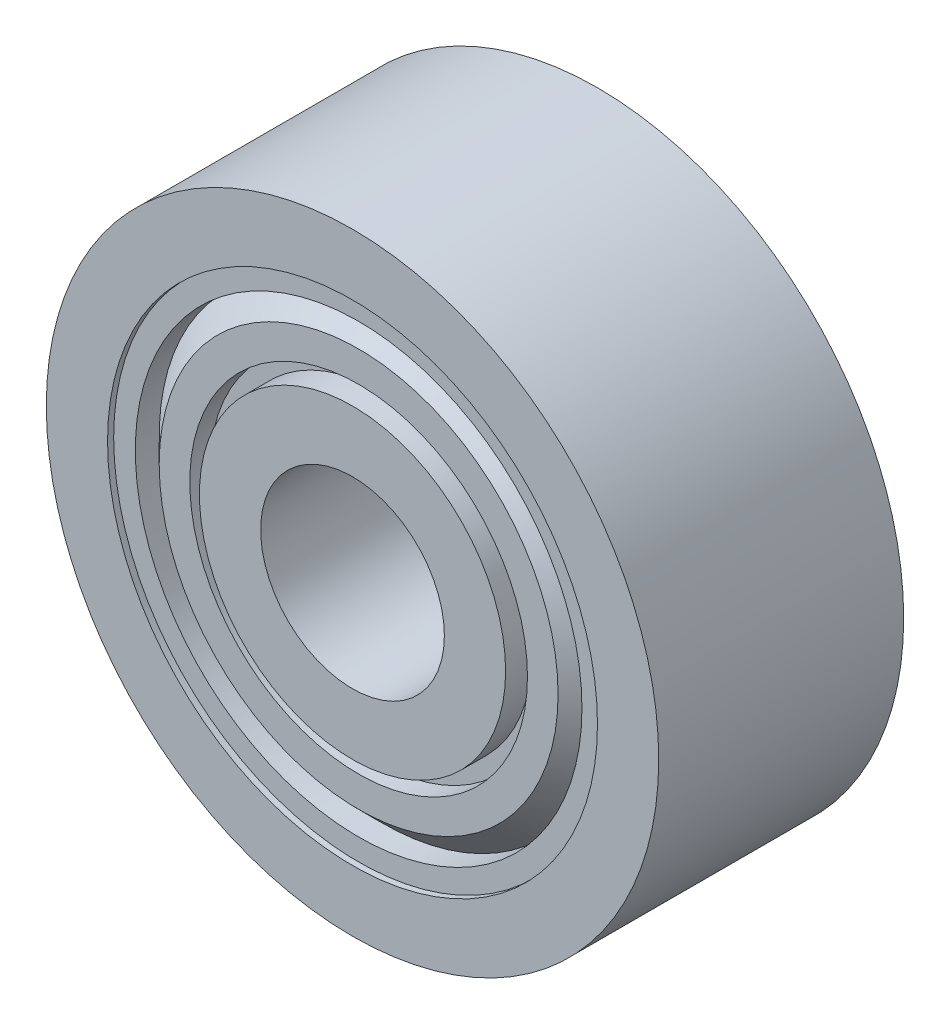
ISO-10303-21;
HEADER;
FILE_DESCRIPTION(('STEP AP214'),'2;1');
FILE_NAME('part.step','',(''),(''),'','','');
FILE_SCHEMA(('AUTOMOTIVE_DESIGN { 1 0 10303 214 1 1 1 1 }'));
ENDSEC;
DATA;
#1=APPLICATION_CONTEXT('core data for automotive mechanical design processes');
#2=APPLICATION_PROTOCOL_DEFINITION('international standard','automotive_design',2000,#1);
#3=PRODUCT_CONTEXT('',#1,'mechanical');
#4=PRODUCT('Part','Part','',(#3));
#5=PRODUCT_RELATED_PRODUCT_CATEGORY('part','',(#4));
#6=PRODUCT_DEFINITION_FORMATION('','',#4);
#7=PRODUCT_DEFINITION_CONTEXT('part definition',#1,'design');
#8=PRODUCT_DEFINITION('design','',#6,#7);
#9=PRODUCT_DEFINITION_SHAPE('','',#8);
#10=(LENGTH_UNIT() NAMED_UNIT(*) SI_UNIT(.MILLI.,.METRE.));
#11=(NAMED_UNIT(*) PLANE_ANGLE_UNIT() SI_UNIT($,.RADIAN.));
#12=(NAMED_UNIT(*) SI_UNIT($,.STERADIAN.) SOLID_ANGLE_UNIT());
#13=UNCERTAINTY_MEASURE_WITH_UNIT(LENGTH_MEASURE(1.E-05),#10,'distance_accuracy_value','');
#14=(GEOMETRIC_REPRESENTATION_CONTEXT(3) GLOBAL_UNCERTAINTY_ASSIGNED_CONTEXT((#13)) GLOBAL_UNIT_ASSIGNED_CONTEXT((#10,
#11,#12)) REPRESENTATION_CONTEXT('',''));
#15=CARTESIAN_POINT('',(0.,0.,0.));
#16=DIRECTION('',(0.,0.,1.));
#17=DIRECTION('',(1.,0.,0.));
#18=AXIS2_PLACEMENT_3D('',#15,#16,#17);
#19=CARTESIAN_POINT('',(0.,1.5,2.));
#20=DIRECTION('',(0.,0.,-1.));
#21=DIRECTION('',(-1.,0.,0.));
#22=AXIS2_PLACEMENT_3D('',#19,#20,#21);
#23=PLANE('',#22);
#24=CARTESIAN_POINT('',(0.,0.,2.));
#25=DIRECTION('',(0.,0.,1.));
#26=DIRECTION('',(1.,0.,0.));
#27=AXIS2_PLACEMENT_3D('',#24,#25,#26);
#28=CIRCLE('',#27,1.5);
#29=CARTESIAN_POINT('',(1.5,0.,2.));
#30=VERTEX_POINT('',#29);
#31=EDGE_CURVE('E103',#30,#30,#28,.T.);
#32=ORIENTED_EDGE('',*,*,#31,.F.);
#33=EDGE_LOOP('',(#32));
#34=FACE_BOUND('',#33,.T.);
#35=CARTESIAN_POINT('',(0.,0.,2.));
#36=DIRECTION('',(0.,0.,1.));
#37=DIRECTION('',(1.,0.,0.));
#38=AXIS2_PLACEMENT_3D('',#35,#36,#37);
#39=CIRCLE('',#38,2.5);
#40=CARTESIAN_POINT('',(2.5,0.,2.));
#41=VERTEX_POINT('',#40);
#42=EDGE_CURVE('E10',#41,#41,#39,.T.);
#43=ORIENTED_EDGE('',*,*,#42,.T.);
#44=EDGE_LOOP('',(#43));
#45=FACE_BOUND('',#44,.T.);
#46=ADVANCED_FACE('F33',(#34,#45),#23,.F.);
#47=CARTESIAN_POINT('',(0.,0.,4.42204301075269));
#48=DIRECTION('',(0.,0.,1.));
#49=DIRECTION('',(1.,0.,0.));
#50=AXIS2_PLACEMENT_3D('',#47,#48,#49);
#51=CYLINDRICAL_SURFACE('',#50,2.5);
#52=ORIENTED_EDGE('',*,*,#42,.F.);
#53=EDGE_LOOP('',(#52));
#54=FACE_BOUND('',#53,.T.);
#55=CARTESIAN_POINT('',(0.,0.,1.5747311827957));
#56=DIRECTION('',(0.,0.,1.));
#57=DIRECTION('',(1.,0.,0.));
#58=AXIS2_PLACEMENT_3D('',#55,#56,#57);
#59=CIRCLE('',#58,2.5);
#60=CARTESIAN_POINT('',(2.5,0.,1.5747311827957));
#61=VERTEX_POINT('',#60);
#62=EDGE_CURVE('E39',#61,#61,#59,.T.);
#63=ORIENTED_EDGE('',*,*,#62,.T.);
#64=EDGE_LOOP('',(#63));
#65=FACE_BOUND('',#64,.T.);
#66=ADVANCED_FACE('F110',(#54,#65),#51,.T.);
#67=CARTESIAN_POINT('',(0.,2.5,1.5747311827957));
#68=DIRECTION('',(0.,0.,-1.));
#69=DIRECTION('',(-1.,0.,0.));
#70=AXIS2_PLACEMENT_3D('',#67,#68,#69);
#71=PLANE('',#70);
#72=ORIENTED_EDGE('',*,*,#62,.F.);
#73=EDGE_LOOP('',(#72));
#74=FACE_BOUND('',#73,.T.);
#75=CARTESIAN_POINT('',(0.,0.,1.5747311827957));
#76=DIRECTION('',(0.,0.,1.));
#77=DIRECTION('',(1.,0.,0.));
#78=AXIS2_PLACEMENT_3D('',#75,#76,#77);
#79=CIRCLE('',#78,2.75672043010753);
#80=CARTESIAN_POINT('',(2.75672043010753,0.,1.5747311827957));
#81=VERTEX_POINT('',#80);
#82=EDGE_CURVE('E43',#81,#81,#79,.T.);
#83=ORIENTED_EDGE('',*,*,#82,.T.);
#84=EDGE_LOOP('',(#83));
#85=FACE_BOUND('',#84,.T.);
#86=ADVANCED_FACE('F114',(#74,#85),#71,.F.);
#87=CARTESIAN_POINT('',(0.,0.,4.42204301075269));
#88=DIRECTION('',(0.,0.,1.));
#89=DIRECTION('',(1.,0.,0.));
#90=AXIS2_PLACEMENT_3D('',#87,#88,#89);
#91=CYLINDRICAL_SURFACE('',#90,2.75672043010753);
#92=ORIENTED_EDGE('',*,*,#82,.F.);
#93=EDGE_LOOP('',(#92));
#94=FACE_BOUND('',#93,.T.);
#95=CARTESIAN_POINT('',(0.,0.,1.90000000000001));
#96=DIRECTION('',(0.,0.,1.));
#97=DIRECTION('',(1.,0.,0.));
#98=AXIS2_PLACEMENT_3D('',#95,#96,#97);
#99=CIRCLE('',#98,2.75672043010753);
#100=CARTESIAN_POINT('',(2.75672043010753,0.,1.90000000000001));
#101=VERTEX_POINT('',#100);
#102=EDGE_CURVE('E47',#101,#101,#99,.T.);
#103=ORIENTED_EDGE('',*,*,#102,.T.);
#104=EDGE_LOOP('',(#103));
#105=FACE_BOUND('',#104,.T.);
#106=ADVANCED_FACE('F119',(#94,#105),#91,.F.);
#107=CARTESIAN_POINT('',(0.,2.75672043010753,1.90000000000001));
#108=DIRECTION('',(0.,0.,-1.));
#109=DIRECTION('',(-1.,0.,0.));
#110=AXIS2_PLACEMENT_3D('',#107,#108,#109);
#111=PLANE('',#110);
#112=ORIENTED_EDGE('',*,*,#102,.F.);
#113=EDGE_LOOP('',(#112));
#114=FACE_BOUND('',#113,.T.);
#115=CARTESIAN_POINT('',(0.,0.,1.90000000000001));
#116=DIRECTION('',(0.,0.,1.));
#117=DIRECTION('',(1.,0.,0.));
#118=AXIS2_PLACEMENT_3D('',#115,#116,#117);
#119=CIRCLE('',#118,3.25672043010753);
#120=CARTESIAN_POINT('',(3.25672043010753,0.,1.90000000000001));
#121=VERTEX_POINT('',#120);
#122=EDGE_CURVE('E52',#121,#121,#119,.T.);
#123=ORIENTED_EDGE('',*,*,#122,.T.);
#124=EDGE_LOOP('',(#123));
#125=FACE_BOUND('',#124,.T.);
#126=ADVANCED_FACE('F125',(#114,#125),#111,.F.);
#127=CARTESIAN_POINT('',(0.,0.,1.51021505376344));
#128=DIRECTION('',(0.,0.,-1.));
#129=DIRECTION('',(-1.,0.,0.));
#130=AXIS2_PLACEMENT_3D('',#127,#128,#129);
#131=CONICAL_SURFACE('',#130,3.64650537634409,0.785398163397449);
#132=ORIENTED_EDGE('',*,*,#122,.F.);
#133=EDGE_LOOP('',(#132));
#134=FACE_BOUND('',#133,.T.);
#135=CARTESIAN_POINT('',(0.,0.,1.51021505376344));
#136=DIRECTION('',(0.,0.,1.));
#137=DIRECTION('',(1.,0.,0.));
#138=AXIS2_PLACEMENT_3D('',#135,#136,#137);
#139=CIRCLE('',#138,3.64650537634409);
#140=CARTESIAN_POINT('',(3.64650537634409,0.,1.51021505376344));
#141=VERTEX_POINT('',#140);
#142=EDGE_CURVE('E55',#141,#141,#139,.T.);
#143=ORIENTED_EDGE('',*,*,#142,.T.);
#144=EDGE_LOOP('',(#143));
#145=FACE_BOUND('',#144,.T.);
#146=ADVANCED_FACE('F129',(#134,#145),#131,.T.);
#147=CARTESIAN_POINT('',(0.,0.,4.42204301075269));
#148=DIRECTION('',(0.,0.,1.));
#149=DIRECTION('',(1.,0.,0.));
#150=AXIS2_PLACEMENT_3D('',#147,#148,#149);
#151=CYLINDRICAL_SURFACE('',#150,3.64650537634409);
#152=ORIENTED_EDGE('',*,*,#142,.F.);
#153=EDGE_LOOP('',(#152));
#154=FACE_BOUND('',#153,.T.);
#155=CARTESIAN_POINT('',(0.,0.,1.9));
#156=DIRECTION('',(0.,0.,1.));
#157=DIRECTION('',(1.,0.,0.));
#158=AXIS2_PLACEMENT_3D('',#155,#156,#157);
#159=CIRCLE('',#158,3.64650537634409);
#160=CARTESIAN_POINT('',(3.64650537634409,0.,1.9));
#161=VERTEX_POINT('',#160);
#162=EDGE_CURVE('E58',#161,#161,#159,.T.);
#163=ORIENTED_EDGE('',*,*,#162,.T.);
#164=EDGE_LOOP('',(#163));
#165=FACE_BOUND('',#164,.T.);
#166=ADVANCED_FACE('F133',(#154,#165),#151,.F.);
#167=CARTESIAN_POINT('',(0.,3.64650537634409,1.9));
#168=DIRECTION('',(0.,0.,-1.));
#169=DIRECTION('',(-1.,0.,0.));
#170=AXIS2_PLACEMENT_3D('',#167,#168,#169);
#171=PLANE('',#170);
#172=ORIENTED_EDGE('',*,*,#162,.F.);
#173=EDGE_LOOP('',(#172));
#174=FACE_BOUND('',#173,.T.);
#175=CARTESIAN_POINT('',(0.,0.,1.9));
#176=DIRECTION('',(0.,0.,1.));
#177=DIRECTION('',(1.,0.,0.));
#178=AXIS2_PLACEMENT_3D('',#175,#176,#177);
#179=CIRCLE('',#178,4.);
#180=CARTESIAN_POINT('',(4.,0.,1.9));
#181=VERTEX_POINT('',#180);
#182=EDGE_CURVE('E61',#181,#181,#179,.T.);
#183=ORIENTED_EDGE('',*,*,#182,.T.);
#184=EDGE_LOOP('',(#183));
#185=FACE_BOUND('',#184,.T.);
#186=ADVANCED_FACE('F137',(#174,#185),#171,.F.);
#187=CARTESIAN_POINT('',(0.,0.,4.42204301075269));
#188=DIRECTION('',(0.,0.,1.));
#189=DIRECTION('',(1.,0.,0.));
#190=AXIS2_PLACEMENT_3D('',#187,#188,#189);
#191=CYLINDRICAL_SURFACE('',#190,4.);
#192=ORIENTED_EDGE('',*,*,#182,.F.);
#193=EDGE_LOOP('',(#192));
#194=FACE_BOUND('',#193,.T.);
#195=CARTESIAN_POINT('',(0.,0.,2.));
#196=DIRECTION('',(0.,0.,1.));
#197=DIRECTION('',(1.,0.,0.));
#198=AXIS2_PLACEMENT_3D('',#195,#196,#197);
#199=CIRCLE('',#198,4.);
#200=CARTESIAN_POINT('',(4.,0.,2.));
#201=VERTEX_POINT('',#200);
#202=EDGE_CURVE('E64',#201,#201,#199,.T.);
#203=ORIENTED_EDGE('',*,*,#202,.T.);
#204=EDGE_LOOP('',(#203));
#205=FACE_BOUND('',#204,.T.);
#206=ADVANCED_FACE('F141',(#194,#205),#191,.F.);
#207=CARTESIAN_POINT('',(0.,4.,2.));
#208=DIRECTION('',(0.,0.,-1.));
#209=DIRECTION('',(-1.,0.,0.));
#210=AXIS2_PLACEMENT_3D('',#207,#208,#209);
#211=PLANE('',#210);
#212=ORIENTED_EDGE('',*,*,#202,.F.);
#213=EDGE_LOOP('',(#212));
#214=FACE_BOUND('',#213,.T.);
#215=CARTESIAN_POINT('',(0.,0.,2.));
#216=DIRECTION('',(0.,0.,1.));
#217=DIRECTION('',(1.,0.,0.));
#218=AXIS2_PLACEMENT_3D('',#215,#216,#217);
#219=CIRCLE('',#218,5.);
#220=CARTESIAN_POINT('',(5.,0.,2.));
#221=VERTEX_POINT('',#220);
#222=EDGE_CURVE('E67',#221,#221,#219,.T.);
#223=ORIENTED_EDGE('',*,*,#222,.T.);
#224=EDGE_LOOP('',(#223));
#225=FACE_BOUND('',#224,.T.);
#226=ADVANCED_FACE('F145',(#214,#225),#211,.F.);
#227=CARTESIAN_POINT('',(0.,0.,4.42204301075269));
#228=DIRECTION('',(0.,0.,1.));
#229=DIRECTION('',(1.,0.,0.));
#230=AXIS2_PLACEMENT_3D('',#227,#228,#229);
#231=CYLINDRICAL_SURFACE('',#230,5.);
#232=ORIENTED_EDGE('',*,*,#222,.F.);
#233=EDGE_LOOP('',(#232));
#234=FACE_BOUND('',#233,.T.);
#235=CARTESIAN_POINT('',(0.,0.,-2.));
#236=DIRECTION('',(0.,0.,1.));
#237=DIRECTION('',(1.,0.,0.));
#238=AXIS2_PLACEMENT_3D('',#235,#236,#237);
#239=CIRCLE('',#238,5.);
#240=CARTESIAN_POINT('',(5.,0.,-2.));
#241=VERTEX_POINT('',#240);
#242=EDGE_CURVE('E70',#241,#241,#239,.T.);
#243=ORIENTED_EDGE('',*,*,#242,.T.);
#244=EDGE_LOOP('',(#243));
#245=FACE_BOUND('',#244,.T.);
#246=ADVANCED_FACE('F149',(#234,#245),#231,.T.);
#247=CARTESIAN_POINT('',(0.,4.,-2.));
#248=DIRECTION('',(0.,0.,1.));
#249=DIRECTION('',(1.,0.,0.));
#250=AXIS2_PLACEMENT_3D('',#247,#248,#249);
#251=PLANE('',#250);
#252=ORIENTED_EDGE('',*,*,#242,.F.);
#253=EDGE_LOOP('',(#252));
#254=FACE_BOUND('',#253,.T.);
#255=CARTESIAN_POINT('',(0.,0.,-2.));
#256=DIRECTION('',(0.,0.,1.));
#257=DIRECTION('',(1.,0.,0.));
#258=AXIS2_PLACEMENT_3D('',#255,#256,#257);
#259=CIRCLE('',#258,4.);
#260=CARTESIAN_POINT('',(4.,0.,-2.));
#261=VERTEX_POINT('',#260);
#262=EDGE_CURVE('E73',#261,#261,#259,.T.);
#263=ORIENTED_EDGE('',*,*,#262,.T.);
#264=EDGE_LOOP('',(#263));
#265=FACE_BOUND('',#264,.T.);
#266=ADVANCED_FACE('F153',(#254,#265),#251,.F.);
#267=CARTESIAN_POINT('',(0.,0.,4.42204301075269));
#268=DIRECTION('',(0.,0.,1.));
#269=DIRECTION('',(1.,0.,0.));
#270=AXIS2_PLACEMENT_3D('',#267,#268,#269);
#271=CYLINDRICAL_SURFACE('',#270,4.);
#272=ORIENTED_EDGE('',*,*,#262,.F.);
#273=EDGE_LOOP('',(#272));
#274=FACE_BOUND('',#273,.T.);
#275=CARTESIAN_POINT('',(0.,0.,-1.9));
#276=DIRECTION('',(0.,0.,1.));
#277=DIRECTION('',(1.,0.,0.));
#278=AXIS2_PLACEMENT_3D('',#275,#276,#277);
#279=CIRCLE('',#278,4.);
#280=CARTESIAN_POINT('',(4.,0.,-1.9));
#281=VERTEX_POINT('',#280);
#282=EDGE_CURVE('E76',#281,#281,#279,.T.);
#283=ORIENTED_EDGE('',*,*,#282,.T.);
#284=EDGE_LOOP('',(#283));
#285=FACE_BOUND('',#284,.T.);
#286=ADVANCED_FACE('F157',(#274,#285),#271,.F.);
#287=CARTESIAN_POINT('',(0.,3.64650537634409,-1.9));
#288=DIRECTION('',(0.,0.,1.));
#289=DIRECTION('',(1.,0.,0.));
#290=AXIS2_PLACEMENT_3D('',#287,#288,#289);
#291=PLANE('',#290);
#292=ORIENTED_EDGE('',*,*,#282,.F.);
#293=EDGE_LOOP('',(#292));
#294=FACE_BOUND('',#293,.T.);
#295=CARTESIAN_POINT('',(0.,0.,-1.9));
#296=DIRECTION('',(0.,0.,1.));
#297=DIRECTION('',(1.,0.,0.));
#298=AXIS2_PLACEMENT_3D('',#295,#296,#297);
#299=CIRCLE('',#298,3.64650537634409);
#300=CARTESIAN_POINT('',(3.64650537634409,0.,-1.9));
#301=VERTEX_POINT('',#300);
#302=EDGE_CURVE('E79',#301,#301,#299,.T.);
#303=ORIENTED_EDGE('',*,*,#302,.T.);
#304=EDGE_LOOP('',(#303));
#305=FACE_BOUND('',#304,.T.);
#306=ADVANCED_FACE('F161',(#294,#305),#291,.F.);
#307=CARTESIAN_POINT('',(0.,0.,4.42204301075269));
#308=DIRECTION('',(0.,0.,1.));
#309=DIRECTION('',(1.,0.,0.));
#310=AXIS2_PLACEMENT_3D('',#307,#308,#309);
#311=CYLINDRICAL_SURFACE('',#310,3.64650537634409);
#312=ORIENTED_EDGE('',*,*,#302,.F.);
#313=EDGE_LOOP('',(#312));
#314=FACE_BOUND('',#313,.T.);
#315=CARTESIAN_POINT('',(0.,0.,-1.51021505376344));
#316=DIRECTION('',(0.,0.,1.));
#317=DIRECTION('',(1.,0.,0.));
#318=AXIS2_PLACEMENT_3D('',#315,#316,#317);
#319=CIRCLE('',#318,3.64650537634409);
#320=CARTESIAN_POINT('',(3.64650537634409,0.,-1.51021505376344));
#321=VERTEX_POINT('',#320);
#322=EDGE_CURVE('E82',#321,#321,#319,.T.);
#323=ORIENTED_EDGE('',*,*,#322,.T.);
#324=EDGE_LOOP('',(#323));
#325=FACE_BOUND('',#324,.T.);
#326=ADVANCED_FACE('F165',(#314,#325),#311,.F.);
#327=CARTESIAN_POINT('',(0.,0.,-1.90000000000001));
#328=DIRECTION('',(0.,0.,1.));
#329=DIRECTION('',(1.,0.,0.));
#330=AXIS2_PLACEMENT_3D('',#327,#328,#329);
#331=CONICAL_SURFACE('',#330,3.25672043010753,0.785398163397449);
#332=ORIENTED_EDGE('',*,*,#322,.F.);
#333=EDGE_LOOP('',(#332));
#334=FACE_BOUND('',#333,.T.);
#335=CARTESIAN_POINT('',(0.,0.,-1.90000000000001));
#336=DIRECTION('',(0.,0.,1.));
#337=DIRECTION('',(1.,0.,0.));
#338=AXIS2_PLACEMENT_3D('',#335,#336,#337);
#339=CIRCLE('',#338,3.25672043010753);
#340=CARTESIAN_POINT('',(3.25672043010753,0.,-1.90000000000001));
#341=VERTEX_POINT('',#340);
#342=EDGE_CURVE('E85',#341,#341,#339,.T.);
#343=ORIENTED_EDGE('',*,*,#342,.T.);
#344=EDGE_LOOP('',(#343));
#345=FACE_BOUND('',#344,.T.);
#346=ADVANCED_FACE('F169',(#334,#345),#331,.T.);
#347=CARTESIAN_POINT('',(0.,2.75672043010753,-1.90000000000001));
#348=DIRECTION('',(0.,0.,1.));
#349=DIRECTION('',(1.,0.,0.));
#350=AXIS2_PLACEMENT_3D('',#347,#348,#349);
#351=PLANE('',#350);
#352=ORIENTED_EDGE('',*,*,#342,.F.);
#353=EDGE_LOOP('',(#352));
#354=FACE_BOUND('',#353,.T.);
#355=CARTESIAN_POINT('',(0.,0.,-1.90000000000001));
#356=DIRECTION('',(0.,0.,1.));
#357=DIRECTION('',(1.,0.,0.));
#358=AXIS2_PLACEMENT_3D('',#355,#356,#357);
#359=CIRCLE('',#358,2.75672043010753);
#360=CARTESIAN_POINT('',(2.75672043010753,0.,-1.90000000000001));
#361=VERTEX_POINT('',#360);
#362=EDGE_CURVE('E88',#361,#361,#359,.T.);
#363=ORIENTED_EDGE('',*,*,#362,.T.);
#364=EDGE_LOOP('',(#363));
#365=FACE_BOUND('',#364,.T.);
#366=ADVANCED_FACE('F173',(#354,#365),#351,.F.);
#367=CARTESIAN_POINT('',(0.,0.,4.42204301075269));
#368=DIRECTION('',(0.,0.,1.));
#369=DIRECTION('',(1.,0.,0.));
#370=AXIS2_PLACEMENT_3D('',#367,#368,#369);
#371=CYLINDRICAL_SURFACE('',#370,2.75672043010753);
#372=ORIENTED_EDGE('',*,*,#362,.F.);
#373=EDGE_LOOP('',(#372));
#374=FACE_BOUND('',#373,.T.);
#375=CARTESIAN_POINT('',(0.,0.,-1.5747311827957));
#376=DIRECTION('',(0.,0.,1.));
#377=DIRECTION('',(1.,0.,0.));
#378=AXIS2_PLACEMENT_3D('',#375,#376,#377);
#379=CIRCLE('',#378,2.75672043010753);
#380=CARTESIAN_POINT('',(2.75672043010753,0.,-1.5747311827957));
#381=VERTEX_POINT('',#380);
#382=EDGE_CURVE('E91',#381,#381,#379,.T.);
#383=ORIENTED_EDGE('',*,*,#382,.T.);
#384=EDGE_LOOP('',(#383));
#385=FACE_BOUND('',#384,.T.);
#386=ADVANCED_FACE('F177',(#374,#385),#371,.F.);
#387=CARTESIAN_POINT('',(0.,2.5,-1.5747311827957));
#388=DIRECTION('',(0.,0.,1.));
#389=DIRECTION('',(1.,0.,0.));
#390=AXIS2_PLACEMENT_3D('',#387,#388,#389);
#391=PLANE('',#390);
#392=ORIENTED_EDGE('',*,*,#382,.F.);
#393=EDGE_LOOP('',(#392));
#394=FACE_BOUND('',#393,.T.);
#395=CARTESIAN_POINT('',(0.,0.,-1.5747311827957));
#396=DIRECTION('',(0.,0.,1.));
#397=DIRECTION('',(1.,0.,0.));
#398=AXIS2_PLACEMENT_3D('',#395,#396,#397);
#399=CIRCLE('',#398,2.5);
#400=CARTESIAN_POINT('',(2.5,0.,-1.5747311827957));
#401=VERTEX_POINT('',#400);
#402=EDGE_CURVE('E94',#401,#401,#399,.T.);
#403=ORIENTED_EDGE('',*,*,#402,.T.);
#404=EDGE_LOOP('',(#403));
#405=FACE_BOUND('',#404,.T.);
#406=ADVANCED_FACE('F181',(#394,#405),#391,.F.);
#407=CARTESIAN_POINT('',(0.,0.,4.42204301075269));
#408=DIRECTION('',(0.,0.,1.));
#409=DIRECTION('',(1.,0.,0.));
#410=AXIS2_PLACEMENT_3D('',#407,#408,#409);
#411=CYLINDRICAL_SURFACE('',#410,2.5);
#412=ORIENTED_EDGE('',*,*,#402,.F.);
#413=EDGE_LOOP('',(#412));
#414=FACE_BOUND('',#413,.T.);
#415=CARTESIAN_POINT('',(0.,0.,-2.));
#416=DIRECTION('',(0.,0.,1.));
#417=DIRECTION('',(1.,0.,0.));
#418=AXIS2_PLACEMENT_3D('',#415,#416,#417);
#419=CIRCLE('',#418,2.5);
#420=CARTESIAN_POINT('',(2.5,0.,-2.));
#421=VERTEX_POINT('',#420);
#422=EDGE_CURVE('E97',#421,#421,#419,.T.);
#423=ORIENTED_EDGE('',*,*,#422,.T.);
#424=EDGE_LOOP('',(#423));
#425=FACE_BOUND('',#424,.T.);
#426=ADVANCED_FACE('F185',(#414,#425),#411,.T.);
#427=CARTESIAN_POINT('',(0.,1.5,-2.));
#428=DIRECTION('',(0.,0.,1.));
#429=DIRECTION('',(1.,0.,0.));
#430=AXIS2_PLACEMENT_3D('',#427,#428,#429);
#431=PLANE('',#430);
#432=ORIENTED_EDGE('',*,*,#422,.F.);
#433=EDGE_LOOP('',(#432));
#434=FACE_BOUND('',#433,.T.);
#435=CARTESIAN_POINT('',(0.,0.,-2.));
#436=DIRECTION('',(0.,0.,1.));
#437=DIRECTION('',(1.,0.,0.));
#438=AXIS2_PLACEMENT_3D('',#435,#436,#437);
#439=CIRCLE('',#438,1.5);
#440=CARTESIAN_POINT('',(1.5,0.,-2.));
#441=VERTEX_POINT('',#440);
#442=EDGE_CURVE('E100',#441,#441,#439,.T.);
#443=ORIENTED_EDGE('',*,*,#442,.T.);
#444=EDGE_LOOP('',(#443));
#445=FACE_BOUND('',#444,.T.);
#446=ADVANCED_FACE('F189',(#434,#445),#431,.F.);
#447=CARTESIAN_POINT('',(0.,0.,4.42204301075269));
#448=DIRECTION('',(0.,0.,1.));
#449=DIRECTION('',(1.,0.,0.));
#450=AXIS2_PLACEMENT_3D('',#447,#448,#449);
#451=CYLINDRICAL_SURFACE('',#450,1.5);
#452=ORIENTED_EDGE('',*,*,#442,.F.);
#453=EDGE_LOOP('',(#452));
#454=FACE_BOUND('',#453,.T.);
#455=ORIENTED_EDGE('',*,*,#31,.T.);
#456=EDGE_LOOP('',(#455));
#457=FACE_BOUND('',#456,.T.);
#458=ADVANCED_FACE('F107',(#454,#457),#451,.F.);
#459=CLOSED_SHELL('',(#46,#66,#86,#106,#126,#146,#166,#186,#206,#226,#246,#266,#286,#306,#326,
#346,#366,#386,#406,#426,#446,#458));
#460=MANIFOLD_SOLID_BREP('B2',#459);
#461=ADVANCED_BREP_SHAPE_REPRESENTATION('',(#18,#460),#14);
#462=SHAPE_DEFINITION_REPRESENTATION(#9,#461);
ENDSEC;
END-ISO-10303-21;
